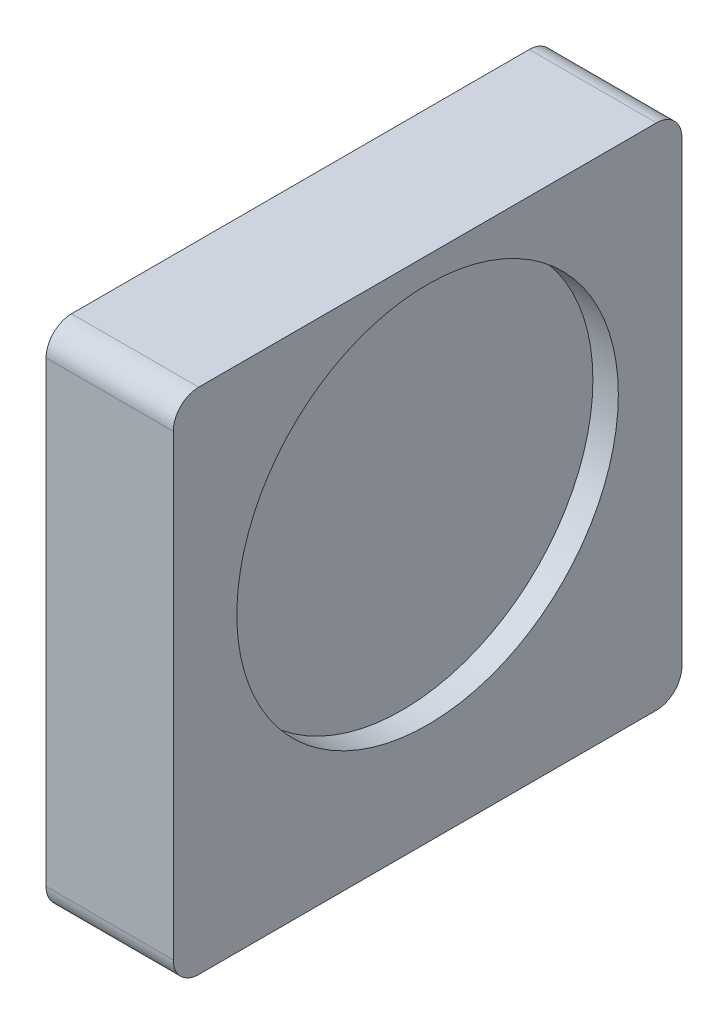
ISO-10303-21;
HEADER;
FILE_DESCRIPTION(('STEP AP214'),'2;1');
FILE_NAME('part.step','',(''),(''),'','','');
FILE_SCHEMA(('AUTOMOTIVE_DESIGN { 1 0 10303 214 1 1 1 1 }'));
ENDSEC;
DATA;
#1=APPLICATION_CONTEXT('core data for automotive mechanical design processes');
#2=APPLICATION_PROTOCOL_DEFINITION('international standard','automotive_design',2000,#1);
#3=PRODUCT_CONTEXT('',#1,'mechanical');
#4=PRODUCT('Part','Part','',(#3));
#5=PRODUCT_RELATED_PRODUCT_CATEGORY('part','',(#4));
#6=PRODUCT_DEFINITION_FORMATION('','',#4);
#7=PRODUCT_DEFINITION_CONTEXT('part definition',#1,'design');
#8=PRODUCT_DEFINITION('design','',#6,#7);
#9=PRODUCT_DEFINITION_SHAPE('','',#8);
#10=(LENGTH_UNIT() NAMED_UNIT(*) SI_UNIT(.MILLI.,.METRE.));
#11=(NAMED_UNIT(*) PLANE_ANGLE_UNIT() SI_UNIT($,.RADIAN.));
#12=(NAMED_UNIT(*) SI_UNIT($,.STERADIAN.) SOLID_ANGLE_UNIT());
#13=UNCERTAINTY_MEASURE_WITH_UNIT(LENGTH_MEASURE(1.E-05),#10,'distance_accuracy_value','');
#14=(GEOMETRIC_REPRESENTATION_CONTEXT(3) GLOBAL_UNCERTAINTY_ASSIGNED_CONTEXT((#13)) GLOBAL_UNIT_ASSIGNED_CONTEXT((#10,
#11,#12)) REPRESENTATION_CONTEXT('',''));
#15=CARTESIAN_POINT('',(0.,0.,0.));
#16=DIRECTION('',(0.,0.,1.));
#17=DIRECTION('',(1.,0.,0.));
#18=AXIS2_PLACEMENT_3D('',#15,#16,#17);
#19=CARTESIAN_POINT('',(10.,20.,20.));
#20=DIRECTION('',(0.,-1.,0.));
#21=DIRECTION('',(0.,0.,-1.));
#22=AXIS2_PLACEMENT_3D('',#19,#20,#21);
#23=PLANE('',#22);
#24=DIRECTION('',(0.,0.,1.));
#25=VECTOR('',#24,1.);
#26=CARTESIAN_POINT('',(0.,20.,20.));
#27=LINE('',#26,#25);
#28=CARTESIAN_POINT('',(0.,20.,-18.));
#29=VERTEX_POINT('',#28);
#30=CARTESIAN_POINT('',(0.,20.,18.));
#31=VERTEX_POINT('',#30);
#32=EDGE_CURVE('E132',#29,#31,#27,.T.);
#33=ORIENTED_EDGE('',*,*,#32,.T.);
#34=DIRECTION('',(-1.,0.,0.));
#35=VECTOR('',#34,1.);
#36=CARTESIAN_POINT('',(10.,20.,18.));
#37=LINE('',#36,#35);
#38=CARTESIAN_POINT('',(10.,20.,18.));
#39=VERTEX_POINT('',#38);
#40=EDGE_CURVE('E110',#31,#39,#37,.F.);
#41=ORIENTED_EDGE('',*,*,#40,.T.);
#42=DIRECTION('',(0.,0.,1.));
#43=VECTOR('',#42,1.);
#44=CARTESIAN_POINT('',(10.,20.,20.));
#45=LINE('',#44,#43);
#46=CARTESIAN_POINT('',(10.,20.,-18.));
#47=VERTEX_POINT('',#46);
#48=EDGE_CURVE('E142',#47,#39,#45,.T.);
#49=ORIENTED_EDGE('',*,*,#48,.F.);
#50=DIRECTION('',(-1.,0.,0.));
#51=VECTOR('',#50,1.);
#52=CARTESIAN_POINT('',(10.,20.,-18.));
#53=LINE('',#52,#51);
#54=EDGE_CURVE('E115',#47,#29,#53,.T.);
#55=ORIENTED_EDGE('',*,*,#54,.T.);
#56=EDGE_LOOP('',(#33,#41,#49,#55));
#57=FACE_BOUND('',#56,.T.);
#58=ADVANCED_FACE('F39',(#57),#23,.F.);
#59=CARTESIAN_POINT('',(10.,-20.,20.));
#60=DIRECTION('',(0.,0.,-1.));
#61=DIRECTION('',(-1.,0.,0.));
#62=AXIS2_PLACEMENT_3D('',#59,#60,#61);
#63=PLANE('',#62);
#64=DIRECTION('',(0.,-1.,0.));
#65=VECTOR('',#64,1.);
#66=CARTESIAN_POINT('',(10.,-20.,20.));
#67=LINE('',#66,#65);
#68=CARTESIAN_POINT('',(10.,18.,20.));
#69=VERTEX_POINT('',#68);
#70=CARTESIAN_POINT('',(10.,-18.,20.));
#71=VERTEX_POINT('',#70);
#72=EDGE_CURVE('E125',#69,#71,#67,.T.);
#73=ORIENTED_EDGE('',*,*,#72,.F.);
#74=DIRECTION('',(-1.,0.,0.));
#75=VECTOR('',#74,1.);
#76=CARTESIAN_POINT('',(10.,18.,20.));
#77=LINE('',#76,#75);
#78=CARTESIAN_POINT('',(0.,18.,20.));
#79=VERTEX_POINT('',#78);
#80=EDGE_CURVE('E109',#69,#79,#77,.T.);
#81=ORIENTED_EDGE('',*,*,#80,.T.);
#82=DIRECTION('',(0.,-1.,0.));
#83=VECTOR('',#82,1.);
#84=CARTESIAN_POINT('',(0.,-20.,20.));
#85=LINE('',#84,#83);
#86=CARTESIAN_POINT('',(0.,-18.,20.));
#87=VERTEX_POINT('',#86);
#88=EDGE_CURVE('E122',#79,#87,#85,.T.);
#89=ORIENTED_EDGE('',*,*,#88,.T.);
#90=DIRECTION('',(-1.,0.,0.));
#91=VECTOR('',#90,1.);
#92=CARTESIAN_POINT('',(10.,-18.,20.));
#93=LINE('',#92,#91);
#94=EDGE_CURVE('E127',#87,#71,#93,.F.);
#95=ORIENTED_EDGE('',*,*,#94,.T.);
#96=EDGE_LOOP('',(#73,#81,#89,#95));
#97=FACE_BOUND('',#96,.T.);
#98=ADVANCED_FACE('F121',(#97),#63,.F.);
#99=CARTESIAN_POINT('',(10.,-20.,20.));
#100=DIRECTION('',(0.,1.,0.));
#101=DIRECTION('',(0.,0.,1.));
#102=AXIS2_PLACEMENT_3D('',#99,#100,#101);
#103=PLANE('',#102);
#104=DIRECTION('',(0.,0.,-1.));
#105=VECTOR('',#104,1.);
#106=CARTESIAN_POINT('',(0.,-20.,20.));
#107=LINE('',#106,#105);
#108=CARTESIAN_POINT('',(0.,-20.,18.));
#109=VERTEX_POINT('',#108);
#110=CARTESIAN_POINT('',(0.,-20.,-18.));
#111=VERTEX_POINT('',#110);
#112=EDGE_CURVE('E131',#109,#111,#107,.T.);
#113=ORIENTED_EDGE('',*,*,#112,.T.);
#114=DIRECTION('',(-1.,0.,0.));
#115=VECTOR('',#114,1.);
#116=CARTESIAN_POINT('',(10.,-20.,-18.));
#117=LINE('',#116,#115);
#118=CARTESIAN_POINT('',(10.,-20.,-18.));
#119=VERTEX_POINT('',#118);
#120=EDGE_CURVE('E11',#111,#119,#117,.F.);
#121=ORIENTED_EDGE('',*,*,#120,.T.);
#122=DIRECTION('',(0.,0.,-1.));
#123=VECTOR('',#122,1.);
#124=CARTESIAN_POINT('',(10.,-20.,20.));
#125=LINE('',#124,#123);
#126=CARTESIAN_POINT('',(10.,-20.,18.));
#127=VERTEX_POINT('',#126);
#128=EDGE_CURVE('E168',#127,#119,#125,.T.);
#129=ORIENTED_EDGE('',*,*,#128,.F.);
#130=DIRECTION('',(-1.,0.,0.));
#131=VECTOR('',#130,1.);
#132=CARTESIAN_POINT('',(10.,-20.,18.));
#133=LINE('',#132,#131);
#134=EDGE_CURVE('E47',#127,#109,#133,.T.);
#135=ORIENTED_EDGE('',*,*,#134,.T.);
#136=EDGE_LOOP('',(#113,#121,#129,#135));
#137=FACE_BOUND('',#136,.T.);
#138=ADVANCED_FACE('F166',(#137),#103,.F.);
#139=CARTESIAN_POINT('',(10.,-20.,-20.));
#140=DIRECTION('',(0.,0.,1.));
#141=DIRECTION('',(1.,0.,0.));
#142=AXIS2_PLACEMENT_3D('',#139,#140,#141);
#143=PLANE('',#142);
#144=DIRECTION('',(0.,1.,0.));
#145=VECTOR('',#144,1.);
#146=CARTESIAN_POINT('',(0.,-20.,-20.));
#147=LINE('',#146,#145);
#148=CARTESIAN_POINT('',(0.,-18.,-20.));
#149=VERTEX_POINT('',#148);
#150=CARTESIAN_POINT('',(0.,18.,-20.));
#151=VERTEX_POINT('',#150);
#152=EDGE_CURVE('E135',#149,#151,#147,.T.);
#153=ORIENTED_EDGE('',*,*,#152,.T.);
#154=DIRECTION('',(-1.,0.,0.));
#155=VECTOR('',#154,1.);
#156=CARTESIAN_POINT('',(10.,18.,-20.));
#157=LINE('',#156,#155);
#158=CARTESIAN_POINT('',(10.,18.,-20.));
#159=VERTEX_POINT('',#158);
#160=EDGE_CURVE('E54',#151,#159,#157,.F.);
#161=ORIENTED_EDGE('',*,*,#160,.T.);
#162=DIRECTION('',(0.,1.,0.));
#163=VECTOR('',#162,1.);
#164=CARTESIAN_POINT('',(10.,-20.,-20.));
#165=LINE('',#164,#163);
#166=CARTESIAN_POINT('',(10.,-18.,-20.));
#167=VERTEX_POINT('',#166);
#168=EDGE_CURVE('E143',#167,#159,#165,.T.);
#169=ORIENTED_EDGE('',*,*,#168,.F.);
#170=DIRECTION('',(-1.,0.,0.));
#171=VECTOR('',#170,1.);
#172=CARTESIAN_POINT('',(10.,-18.,-20.));
#173=LINE('',#172,#171);
#174=EDGE_CURVE('E159',#167,#149,#173,.T.);
#175=ORIENTED_EDGE('',*,*,#174,.T.);
#176=EDGE_LOOP('',(#153,#161,#169,#175));
#177=FACE_BOUND('',#176,.T.);
#178=ADVANCED_FACE('F175',(#177),#143,.F.);
#179=CARTESIAN_POINT('',(10.,0.,0.));
#180=DIRECTION('',(1.,0.,0.));
#181=DIRECTION('',(0.,0.,-1.));
#182=AXIS2_PLACEMENT_3D('',#179,#180,#181);
#183=PLANE('',#182);
#184=CARTESIAN_POINT('',(10.,3.,0.));
#185=DIRECTION('',(1.,0.,0.));
#186=DIRECTION('',(0.,0.,-1.));
#187=AXIS2_PLACEMENT_3D('',#184,#185,#186);
#188=CIRCLE('',#187,15.);
#189=CARTESIAN_POINT('',(10.,3.,-15.));
#190=VERTEX_POINT('',#189);
#191=EDGE_CURVE('E182',#190,#190,#188,.T.);
#192=ORIENTED_EDGE('',*,*,#191,.F.);
#193=EDGE_LOOP('',(#192));
#194=FACE_BOUND('',#193,.T.);
#195=ORIENTED_EDGE('',*,*,#48,.T.);
#196=CARTESIAN_POINT('',(10.,18.,18.));
#197=DIRECTION('',(1.,0.,0.));
#198=DIRECTION('',(0.,0.,-1.));
#199=AXIS2_PLACEMENT_3D('',#196,#197,#198);
#200=CIRCLE('',#199,2.);
#201=EDGE_CURVE('E157',#39,#69,#200,.T.);
#202=ORIENTED_EDGE('',*,*,#201,.T.);
#203=ORIENTED_EDGE('',*,*,#72,.T.);
#204=CARTESIAN_POINT('',(10.,-18.,18.));
#205=DIRECTION('',(1.,0.,0.));
#206=DIRECTION('',(0.,0.,-1.));
#207=AXIS2_PLACEMENT_3D('',#204,#205,#206);
#208=CIRCLE('',#207,2.);
#209=EDGE_CURVE('E152',#71,#127,#208,.T.);
#210=ORIENTED_EDGE('',*,*,#209,.T.);
#211=ORIENTED_EDGE('',*,*,#128,.T.);
#212=CARTESIAN_POINT('',(10.,-18.,-18.));
#213=DIRECTION('',(1.,0.,0.));
#214=DIRECTION('',(0.,0.,-1.));
#215=AXIS2_PLACEMENT_3D('',#212,#213,#214);
#216=CIRCLE('',#215,2.);
#217=EDGE_CURVE('E61',#119,#167,#216,.T.);
#218=ORIENTED_EDGE('',*,*,#217,.T.);
#219=ORIENTED_EDGE('',*,*,#168,.T.);
#220=CARTESIAN_POINT('',(10.,18.,-18.));
#221=DIRECTION('',(1.,0.,0.));
#222=DIRECTION('',(0.,0.,-1.));
#223=AXIS2_PLACEMENT_3D('',#220,#221,#222);
#224=CIRCLE('',#223,2.);
#225=EDGE_CURVE('E155',#159,#47,#224,.T.);
#226=ORIENTED_EDGE('',*,*,#225,.T.);
#227=EDGE_LOOP('',(#195,#202,#203,#210,#211,#218,#219,#226));
#228=FACE_BOUND('',#227,.T.);
#229=ADVANCED_FACE('F196',(#194,#228),#183,.T.);
#230=CARTESIAN_POINT('',(0.,0.,0.));
#231=DIRECTION('',(1.,0.,0.));
#232=DIRECTION('',(0.,0.,-1.));
#233=AXIS2_PLACEMENT_3D('',#230,#231,#232);
#234=PLANE('',#233);
#235=ORIENTED_EDGE('',*,*,#88,.F.);
#236=CARTESIAN_POINT('',(0.,18.,18.));
#237=DIRECTION('',(1.,0.,0.));
#238=DIRECTION('',(0.,0.,-1.));
#239=AXIS2_PLACEMENT_3D('',#236,#237,#238);
#240=CIRCLE('',#239,2.);
#241=EDGE_CURVE('E105',#79,#31,#240,.F.);
#242=ORIENTED_EDGE('',*,*,#241,.T.);
#243=ORIENTED_EDGE('',*,*,#32,.F.);
#244=CARTESIAN_POINT('',(0.,18.,-18.));
#245=DIRECTION('',(1.,0.,0.));
#246=DIRECTION('',(0.,0.,-1.));
#247=AXIS2_PLACEMENT_3D('',#244,#245,#246);
#248=CIRCLE('',#247,2.);
#249=EDGE_CURVE('E116',#29,#151,#248,.F.);
#250=ORIENTED_EDGE('',*,*,#249,.T.);
#251=ORIENTED_EDGE('',*,*,#152,.F.);
#252=CARTESIAN_POINT('',(0.,-18.,-18.));
#253=DIRECTION('',(1.,0.,0.));
#254=DIRECTION('',(0.,0.,-1.));
#255=AXIS2_PLACEMENT_3D('',#252,#253,#254);
#256=CIRCLE('',#255,2.);
#257=EDGE_CURVE('E146',#149,#111,#256,.F.);
#258=ORIENTED_EDGE('',*,*,#257,.T.);
#259=ORIENTED_EDGE('',*,*,#112,.F.);
#260=CARTESIAN_POINT('',(0.,-18.,18.));
#261=DIRECTION('',(1.,0.,0.));
#262=DIRECTION('',(0.,0.,-1.));
#263=AXIS2_PLACEMENT_3D('',#260,#261,#262);
#264=CIRCLE('',#263,2.);
#265=EDGE_CURVE('E126',#109,#87,#264,.F.);
#266=ORIENTED_EDGE('',*,*,#265,.T.);
#267=EDGE_LOOP('',(#235,#242,#243,#250,#251,#258,#259,#266));
#268=FACE_BOUND('',#267,.T.);
#269=ADVANCED_FACE('F129',(#268),#234,.F.);
#270=CARTESIAN_POINT('',(8.,3.,0.));
#271=DIRECTION('',(1.,0.,0.));
#272=DIRECTION('',(0.,0.,-1.));
#273=AXIS2_PLACEMENT_3D('',#270,#271,#272);
#274=CYLINDRICAL_SURFACE('',#273,15.);
#275=CARTESIAN_POINT('',(8.,3.,0.));
#276=DIRECTION('',(1.,0.,0.));
#277=DIRECTION('',(0.,0.,-1.));
#278=AXIS2_PLACEMENT_3D('',#275,#276,#277);
#279=CIRCLE('',#278,15.);
#280=CARTESIAN_POINT('',(8.,3.,-15.));
#281=VERTEX_POINT('',#280);
#282=EDGE_CURVE('E137',#281,#281,#279,.T.);
#283=ORIENTED_EDGE('',*,*,#282,.F.);
#284=EDGE_LOOP('',(#283));
#285=FACE_BOUND('',#284,.T.);
#286=ORIENTED_EDGE('',*,*,#191,.T.);
#287=EDGE_LOOP('',(#286));
#288=FACE_BOUND('',#287,.T.);
#289=ADVANCED_FACE('F190',(#285,#288),#274,.F.);
#290=CARTESIAN_POINT('',(8.,3.,0.));
#291=DIRECTION('',(1.,0.,0.));
#292=DIRECTION('',(0.,0.,-1.));
#293=AXIS2_PLACEMENT_3D('',#290,#291,#292);
#294=PLANE('',#293);
#295=ORIENTED_EDGE('',*,*,#282,.T.);
#296=EDGE_LOOP('',(#295));
#297=FACE_BOUND('',#296,.T.);
#298=ADVANCED_FACE('F188',(#297),#294,.T.);
#299=CARTESIAN_POINT('',(10.,18.,18.));
#300=DIRECTION('',(-1.,0.,0.));
#301=DIRECTION('',(0.,0.,1.));
#302=AXIS2_PLACEMENT_3D('',#299,#300,#301);
#303=CYLINDRICAL_SURFACE('',#302,2.);
#304=ORIENTED_EDGE('',*,*,#201,.F.);
#305=ORIENTED_EDGE('',*,*,#40,.F.);
#306=ORIENTED_EDGE('',*,*,#241,.F.);
#307=ORIENTED_EDGE('',*,*,#80,.F.);
#308=EDGE_LOOP('',(#304,#305,#306,#307));
#309=FACE_BOUND('',#308,.T.);
#310=ADVANCED_FACE('F108',(#309),#303,.T.);
#311=CARTESIAN_POINT('',(10.,18.,-18.));
#312=DIRECTION('',(-1.,0.,0.));
#313=DIRECTION('',(0.,0.,1.));
#314=AXIS2_PLACEMENT_3D('',#311,#312,#313);
#315=CYLINDRICAL_SURFACE('',#314,2.);
#316=ORIENTED_EDGE('',*,*,#225,.F.);
#317=ORIENTED_EDGE('',*,*,#160,.F.);
#318=ORIENTED_EDGE('',*,*,#249,.F.);
#319=ORIENTED_EDGE('',*,*,#54,.F.);
#320=EDGE_LOOP('',(#316,#317,#318,#319));
#321=FACE_BOUND('',#320,.T.);
#322=ADVANCED_FACE('F203',(#321),#315,.T.);
#323=CARTESIAN_POINT('',(10.,-18.,-18.));
#324=DIRECTION('',(-1.,0.,0.));
#325=DIRECTION('',(0.,0.,1.));
#326=AXIS2_PLACEMENT_3D('',#323,#324,#325);
#327=CYLINDRICAL_SURFACE('',#326,2.);
#328=ORIENTED_EDGE('',*,*,#217,.F.);
#329=ORIENTED_EDGE('',*,*,#120,.F.);
#330=ORIENTED_EDGE('',*,*,#257,.F.);
#331=ORIENTED_EDGE('',*,*,#174,.F.);
#332=EDGE_LOOP('',(#328,#329,#330,#331));
#333=FACE_BOUND('',#332,.T.);
#334=ADVANCED_FACE('F174',(#333),#327,.T.);
#335=CARTESIAN_POINT('',(10.,-18.,18.));
#336=DIRECTION('',(-1.,0.,0.));
#337=DIRECTION('',(0.,0.,1.));
#338=AXIS2_PLACEMENT_3D('',#335,#336,#337);
#339=CYLINDRICAL_SURFACE('',#338,2.);
#340=ORIENTED_EDGE('',*,*,#209,.F.);
#341=ORIENTED_EDGE('',*,*,#94,.F.);
#342=ORIENTED_EDGE('',*,*,#265,.F.);
#343=ORIENTED_EDGE('',*,*,#134,.F.);
#344=EDGE_LOOP('',(#340,#341,#342,#343));
#345=FACE_BOUND('',#344,.T.);
#346=ADVANCED_FACE('F41',(#345),#339,.T.);
#347=CLOSED_SHELL('',(#58,#98,#138,#178,#229,#269,#289,#298,#310,#322,#334,#346));
#348=MANIFOLD_SOLID_BREP('B2',#347);
#349=ADVANCED_BREP_SHAPE_REPRESENTATION('',(#18,#348),#14);
#350=SHAPE_DEFINITION_REPRESENTATION(#9,#349);
ENDSEC;
END-ISO-10303-21;
